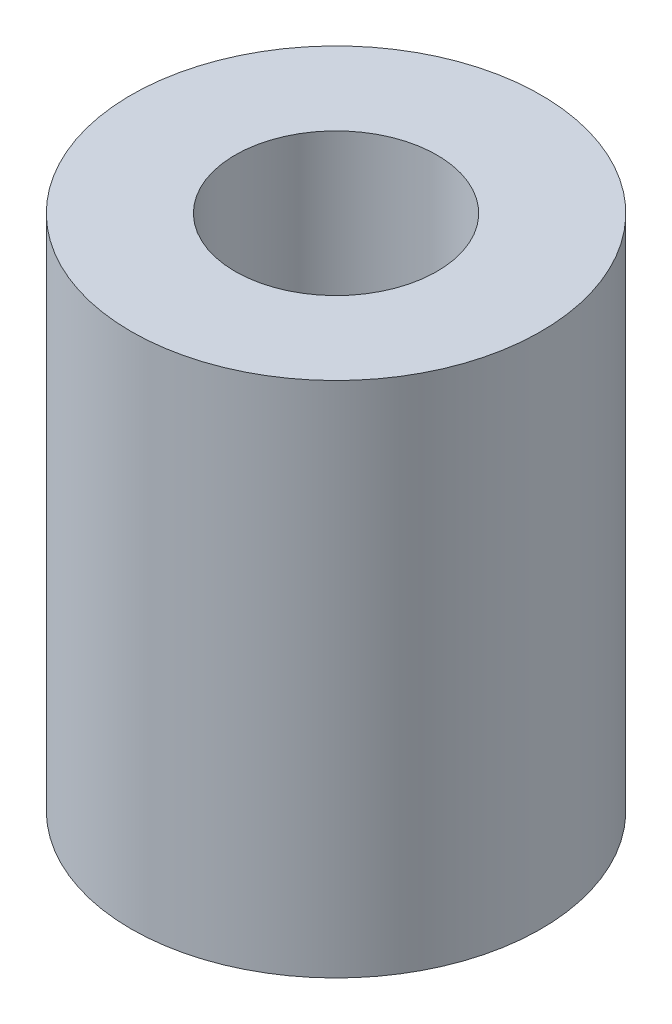
ISO-10303-21;
HEADER;
FILE_DESCRIPTION(('STEP AP214'),'2;1');
FILE_NAME('part.step','',(''),(''),'','','');
FILE_SCHEMA(('AUTOMOTIVE_DESIGN { 1 0 10303 214 1 1 1 1 }'));
ENDSEC;
DATA;
#1=APPLICATION_CONTEXT('core data for automotive mechanical design processes');
#2=APPLICATION_PROTOCOL_DEFINITION('international standard','automotive_design',2000,#1);
#3=PRODUCT_CONTEXT('',#1,'mechanical');
#4=PRODUCT('Part','Part','',(#3));
#5=PRODUCT_RELATED_PRODUCT_CATEGORY('part','',(#4));
#6=PRODUCT_DEFINITION_FORMATION('','',#4);
#7=PRODUCT_DEFINITION_CONTEXT('part definition',#1,'design');
#8=PRODUCT_DEFINITION('design','',#6,#7);
#9=PRODUCT_DEFINITION_SHAPE('','',#8);
#10=(LENGTH_UNIT() NAMED_UNIT(*) SI_UNIT(.MILLI.,.METRE.));
#11=(NAMED_UNIT(*) PLANE_ANGLE_UNIT() SI_UNIT($,.RADIAN.));
#12=(NAMED_UNIT(*) SI_UNIT($,.STERADIAN.) SOLID_ANGLE_UNIT());
#13=UNCERTAINTY_MEASURE_WITH_UNIT(LENGTH_MEASURE(1.E-05),#10,'distance_accuracy_value','');
#14=(GEOMETRIC_REPRESENTATION_CONTEXT(3) GLOBAL_UNCERTAINTY_ASSIGNED_CONTEXT((#13)) GLOBAL_UNIT_ASSIGNED_CONTEXT((#10,
#11,#12)) REPRESENTATION_CONTEXT('',''));
#15=CARTESIAN_POINT('',(0.,0.,0.));
#16=DIRECTION('',(0.,0.,1.));
#17=DIRECTION('',(1.,0.,0.));
#18=AXIS2_PLACEMENT_3D('',#15,#16,#17);
#19=CARTESIAN_POINT('',(0.,25.,0.));
#20=DIRECTION('',(0.,1.,0.));
#21=DIRECTION('',(0.,0.,1.));
#22=AXIS2_PLACEMENT_3D('',#19,#20,#21);
#23=PLANE('',#22);
#24=CARTESIAN_POINT('',(0.,25.,0.));
#25=DIRECTION('',(0.,1.,0.));
#26=DIRECTION('',(0.,0.,1.));
#27=AXIS2_PLACEMENT_3D('',#24,#25,#26);
#28=CIRCLE('',#27,9.9);
#29=CARTESIAN_POINT('',(0.,25.,9.9));
#30=VERTEX_POINT('',#29);
#31=EDGE_CURVE('E10',#30,#30,#28,.T.);
#32=ORIENTED_EDGE('',*,*,#31,.T.);
#33=EDGE_LOOP('',(#32));
#34=FACE_BOUND('',#33,.T.);
#35=CARTESIAN_POINT('',(0.,25.,0.));
#36=DIRECTION('',(0.,1.,0.));
#37=DIRECTION('',(0.,0.,1.));
#38=AXIS2_PLACEMENT_3D('',#35,#36,#37);
#39=CIRCLE('',#38,4.875);
#40=CARTESIAN_POINT('',(0.,25.,4.875));
#41=VERTEX_POINT('',#40);
#42=EDGE_CURVE('E50',#41,#41,#39,.T.);
#43=ORIENTED_EDGE('',*,*,#42,.F.);
#44=EDGE_LOOP('',(#43));
#45=FACE_BOUND('',#44,.T.);
#46=ADVANCED_FACE('F37',(#34,#45),#23,.T.);
#47=CARTESIAN_POINT('',(0.,0.,0.));
#48=DIRECTION('',(0.,1.,0.));
#49=DIRECTION('',(0.,0.,1.));
#50=AXIS2_PLACEMENT_3D('',#47,#48,#49);
#51=PLANE('',#50);
#52=CARTESIAN_POINT('',(0.,0.,0.));
#53=DIRECTION('',(0.,1.,0.));
#54=DIRECTION('',(0.,0.,1.));
#55=AXIS2_PLACEMENT_3D('',#52,#53,#54);
#56=CIRCLE('',#55,9.9);
#57=CARTESIAN_POINT('',(0.,0.,9.9));
#58=VERTEX_POINT('',#57);
#59=EDGE_CURVE('E41',#58,#58,#56,.T.);
#60=ORIENTED_EDGE('',*,*,#59,.F.);
#61=EDGE_LOOP('',(#60));
#62=FACE_BOUND('',#61,.T.);
#63=CARTESIAN_POINT('',(0.,0.,0.));
#64=DIRECTION('',(0.,1.,0.));
#65=DIRECTION('',(0.,0.,1.));
#66=AXIS2_PLACEMENT_3D('',#63,#64,#65);
#67=CIRCLE('',#66,4.875);
#68=CARTESIAN_POINT('',(0.,0.,4.875));
#69=VERTEX_POINT('',#68);
#70=EDGE_CURVE('E52',#69,#69,#67,.T.);
#71=ORIENTED_EDGE('',*,*,#70,.T.);
#72=EDGE_LOOP('',(#71));
#73=FACE_BOUND('',#72,.T.);
#74=ADVANCED_FACE('F64',(#62,#73),#51,.F.);
#75=CARTESIAN_POINT('',(0.,25.,0.));
#76=DIRECTION('',(0.,-1.,0.));
#77=DIRECTION('',(0.,0.,-1.));
#78=AXIS2_PLACEMENT_3D('',#75,#76,#77);
#79=CYLINDRICAL_SURFACE('',#78,9.9);
#80=ORIENTED_EDGE('',*,*,#31,.F.);
#81=EDGE_LOOP('',(#80));
#82=FACE_BOUND('',#81,.T.);
#83=ORIENTED_EDGE('',*,*,#59,.T.);
#84=EDGE_LOOP('',(#83));
#85=FACE_BOUND('',#84,.T.);
#86=ADVANCED_FACE('F39',(#82,#85),#79,.T.);
#87=CARTESIAN_POINT('',(0.,25.,0.));
#88=DIRECTION('',(0.,-1.,0.));
#89=DIRECTION('',(0.,0.,-1.));
#90=AXIS2_PLACEMENT_3D('',#87,#88,#89);
#91=CYLINDRICAL_SURFACE('',#90,4.875);
#92=ORIENTED_EDGE('',*,*,#42,.T.);
#93=EDGE_LOOP('',(#92));
#94=FACE_BOUND('',#93,.T.);
#95=ORIENTED_EDGE('',*,*,#70,.F.);
#96=EDGE_LOOP('',(#95));
#97=FACE_BOUND('',#96,.T.);
#98=ADVANCED_FACE('F60',(#94,#97),#91,.F.);
#99=CLOSED_SHELL('',(#46,#74,#86,#98));
#100=MANIFOLD_SOLID_BREP('B2',#99);
#101=ADVANCED_BREP_SHAPE_REPRESENTATION('',(#18,#100),#14);
#102=SHAPE_DEFINITION_REPRESENTATION(#9,#101);
ENDSEC;
END-ISO-10303-21;
